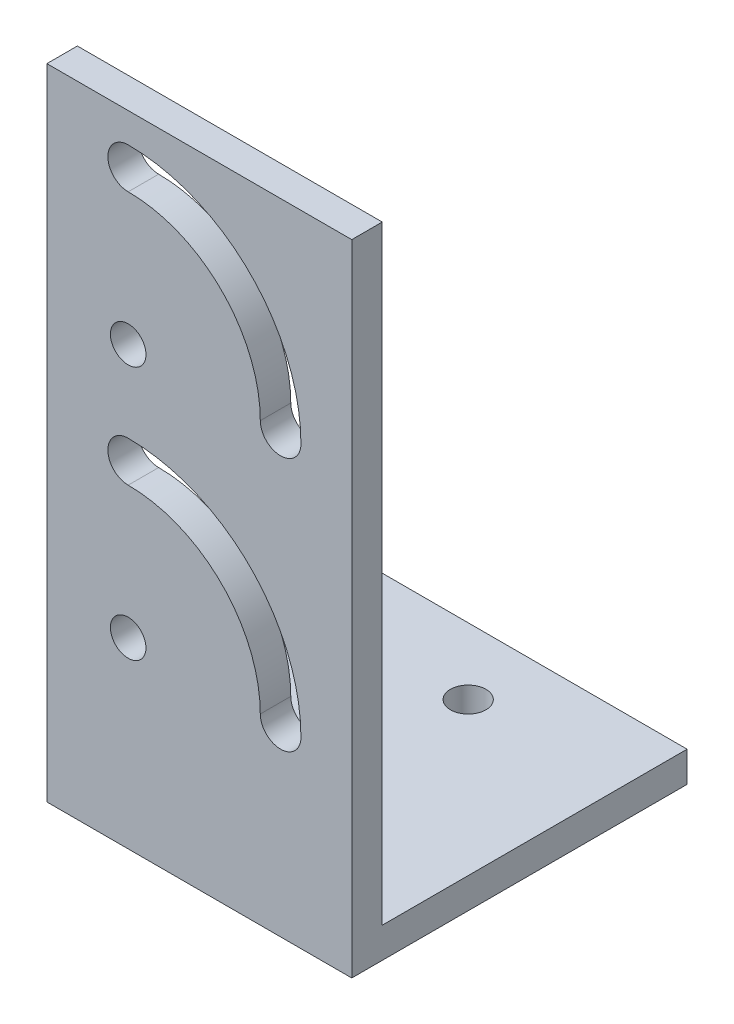
ISO-10303-21;
HEADER;
FILE_DESCRIPTION(('STEP AP214'),'2;1');
FILE_NAME('part.step','',(''),(''),'','','');
FILE_SCHEMA(('AUTOMOTIVE_DESIGN { 1 0 10303 214 1 1 1 1 }'));
ENDSEC;
DATA;
#1=APPLICATION_CONTEXT('core data for automotive mechanical design processes');
#2=APPLICATION_PROTOCOL_DEFINITION('international standard','automotive_design',2000,#1);
#3=PRODUCT_CONTEXT('',#1,'mechanical');
#4=PRODUCT('Part','Part','',(#3));
#5=PRODUCT_RELATED_PRODUCT_CATEGORY('part','',(#4));
#6=PRODUCT_DEFINITION_FORMATION('','',#4);
#7=PRODUCT_DEFINITION_CONTEXT('part definition',#1,'design');
#8=PRODUCT_DEFINITION('design','',#6,#7);
#9=PRODUCT_DEFINITION_SHAPE('','',#8);
#10=(LENGTH_UNIT() NAMED_UNIT(*) SI_UNIT(.MILLI.,.METRE.));
#11=(NAMED_UNIT(*) PLANE_ANGLE_UNIT() SI_UNIT($,.RADIAN.));
#12=(NAMED_UNIT(*) SI_UNIT($,.STERADIAN.) SOLID_ANGLE_UNIT());
#13=UNCERTAINTY_MEASURE_WITH_UNIT(LENGTH_MEASURE(1.E-05),#10,'distance_accuracy_value','');
#14=(GEOMETRIC_REPRESENTATION_CONTEXT(3) GLOBAL_UNCERTAINTY_ASSIGNED_CONTEXT((#13)) GLOBAL_UNIT_ASSIGNED_CONTEXT((#10,
#11,#12)) REPRESENTATION_CONTEXT('',''));
#15=CARTESIAN_POINT('',(0.,0.,0.));
#16=DIRECTION('',(0.,0.,1.));
#17=DIRECTION('',(1.,0.,0.));
#18=AXIS2_PLACEMENT_3D('',#15,#16,#17);
#19=CARTESIAN_POINT('',(0.,0.,15.));
#20=DIRECTION('',(0.,0.,-1.));
#21=DIRECTION('',(-1.,0.,0.));
#22=AXIS2_PLACEMENT_3D('',#19,#20,#21);
#23=PLANE('',#22);
#24=CARTESIAN_POINT('',(-7.,43.,15.));
#25=DIRECTION('',(0.,0.,1.));
#26=DIRECTION('',(1.,0.,0.));
#27=AXIS2_PLACEMENT_3D('',#24,#25,#26);
#28=CIRCLE('',#27,1.75);
#29=CARTESIAN_POINT('',(-5.25,43.,15.));
#30=VERTEX_POINT('',#29);
#31=EDGE_CURVE('E170',#30,#30,#28,.T.);
#32=ORIENTED_EDGE('',*,*,#31,.T.);
#33=EDGE_LOOP('',(#32));
#34=FACE_BOUND('',#33,.T.);
#35=CARTESIAN_POINT('',(-7.,33.,15.));
#36=DIRECTION('',(0.,0.,1.));
#37=DIRECTION('',(1.,0.,0.));
#38=AXIS2_PLACEMENT_3D('',#35,#36,#37);
#39=CIRCLE('',#38,2.);
#40=CARTESIAN_POINT('',(-7.,35.,15.));
#41=VERTEX_POINT('',#40);
#42=CARTESIAN_POINT('',(-7.,31.,15.));
#43=VERTEX_POINT('',#42);
#44=EDGE_CURVE('E179',#41,#43,#39,.T.);
#45=ORIENTED_EDGE('',*,*,#44,.T.);
#46=CARTESIAN_POINT('',(-7.,18.,15.));
#47=DIRECTION('',(0.,0.,-1.));
#48=DIRECTION('',(1.,0.,0.));
#49=AXIS2_PLACEMENT_3D('',#46,#47,#48);
#50=CIRCLE('',#49,13.);
#51=CARTESIAN_POINT('',(6.,18.,15.));
#52=VERTEX_POINT('',#51);
#53=EDGE_CURVE('E182',#43,#52,#50,.T.);
#54=ORIENTED_EDGE('',*,*,#53,.T.);
#55=CARTESIAN_POINT('',(8.,18.,15.));
#56=DIRECTION('',(0.,0.,1.));
#57=DIRECTION('',(1.,0.,0.));
#58=AXIS2_PLACEMENT_3D('',#55,#56,#57);
#59=CIRCLE('',#58,2.);
#60=CARTESIAN_POINT('',(10.,18.,15.));
#61=VERTEX_POINT('',#60);
#62=EDGE_CURVE('E58',#52,#61,#59,.T.);
#63=ORIENTED_EDGE('',*,*,#62,.T.);
#64=CARTESIAN_POINT('',(-7.,18.,15.));
#65=DIRECTION('',(0.,0.,1.));
#66=DIRECTION('',(1.,0.,0.));
#67=AXIS2_PLACEMENT_3D('',#64,#65,#66);
#68=CIRCLE('',#67,17.);
#69=EDGE_CURVE('E187',#61,#41,#68,.T.);
#70=ORIENTED_EDGE('',*,*,#69,.T.);
#71=EDGE_LOOP('',(#45,#54,#63,#70));
#72=FACE_BOUND('',#71,.T.);
#73=DIRECTION('',(1.,0.,0.));
#74=VECTOR('',#73,1.);
#75=CARTESIAN_POINT('',(-15.,3.,15.));
#76=LINE('',#75,#74);
#77=CARTESIAN_POINT('',(-15.,3.,15.));
#78=VERTEX_POINT('',#77);
#79=CARTESIAN_POINT('',(15.,3.,15.));
#80=VERTEX_POINT('',#79);
#81=EDGE_CURVE('E255',#78,#80,#76,.T.);
#82=ORIENTED_EDGE('',*,*,#81,.F.);
#83=DIRECTION('',(0.,-1.,0.));
#84=VECTOR('',#83,1.);
#85=CARTESIAN_POINT('',(-15.,0.,15.));
#86=LINE('',#85,#84);
#87=CARTESIAN_POINT('',(-15.,62.9241904633983,15.));
#88=VERTEX_POINT('',#87);
#89=EDGE_CURVE('E204',#88,#78,#86,.T.);
#90=ORIENTED_EDGE('',*,*,#89,.F.);
#91=DIRECTION('',(-1.,0.,0.));
#92=VECTOR('',#91,1.);
#93=CARTESIAN_POINT('',(-15.,62.9241904633983,15.));
#94=LINE('',#93,#92);
#95=CARTESIAN_POINT('',(15.,62.9241904633983,15.));
#96=VERTEX_POINT('',#95);
#97=EDGE_CURVE('E215',#96,#88,#94,.T.);
#98=ORIENTED_EDGE('',*,*,#97,.F.);
#99=DIRECTION('',(0.,1.,0.));
#100=VECTOR('',#99,1.);
#101=CARTESIAN_POINT('',(15.,0.,15.));
#102=LINE('',#101,#100);
#103=EDGE_CURVE('E225',#80,#96,#102,.T.);
#104=ORIENTED_EDGE('',*,*,#103,.F.);
#105=EDGE_LOOP('',(#82,#90,#98,#104));
#106=FACE_BOUND('',#105,.T.);
#107=CARTESIAN_POINT('',(-7.,58.,15.));
#108=DIRECTION('',(0.,0.,1.));
#109=DIRECTION('',(1.,0.,0.));
#110=AXIS2_PLACEMENT_3D('',#107,#108,#109);
#111=CIRCLE('',#110,2.);
#112=CARTESIAN_POINT('',(-7.,60.,15.));
#113=VERTEX_POINT('',#112);
#114=CARTESIAN_POINT('',(-7.,56.,15.));
#115=VERTEX_POINT('',#114);
#116=EDGE_CURVE('E140',#113,#115,#111,.T.);
#117=ORIENTED_EDGE('',*,*,#116,.T.);
#118=CARTESIAN_POINT('',(-7.,43.,15.));
#119=DIRECTION('',(0.,0.,-1.));
#120=DIRECTION('',(1.,0.,0.));
#121=AXIS2_PLACEMENT_3D('',#118,#119,#120);
#122=CIRCLE('',#121,13.);
#123=CARTESIAN_POINT('',(6.,43.,15.));
#124=VERTEX_POINT('',#123);
#125=EDGE_CURVE('E151',#115,#124,#122,.T.);
#126=ORIENTED_EDGE('',*,*,#125,.T.);
#127=CARTESIAN_POINT('',(8.,43.,15.));
#128=DIRECTION('',(0.,0.,1.));
#129=DIRECTION('',(1.,0.,0.));
#130=AXIS2_PLACEMENT_3D('',#127,#128,#129);
#131=CIRCLE('',#130,2.);
#132=CARTESIAN_POINT('',(10.,43.,15.));
#133=VERTEX_POINT('',#132);
#134=EDGE_CURVE('E50',#124,#133,#131,.T.);
#135=ORIENTED_EDGE('',*,*,#134,.T.);
#136=CARTESIAN_POINT('',(-7.,43.,15.));
#137=DIRECTION('',(0.,0.,1.));
#138=DIRECTION('',(1.,0.,0.));
#139=AXIS2_PLACEMENT_3D('',#136,#137,#138);
#140=CIRCLE('',#139,17.);
#141=EDGE_CURVE('E148',#133,#113,#140,.T.);
#142=ORIENTED_EDGE('',*,*,#141,.T.);
#143=EDGE_LOOP('',(#117,#126,#135,#142));
#144=FACE_BOUND('',#143,.T.);
#145=CARTESIAN_POINT('',(-7.,18.,15.));
#146=DIRECTION('',(0.,0.,1.));
#147=DIRECTION('',(1.,0.,0.));
#148=AXIS2_PLACEMENT_3D('',#145,#146,#147);
#149=CIRCLE('',#148,1.75);
#150=CARTESIAN_POINT('',(-5.25,18.,15.));
#151=VERTEX_POINT('',#150);
#152=EDGE_CURVE('E194',#151,#151,#149,.T.);
#153=ORIENTED_EDGE('',*,*,#152,.T.);
#154=EDGE_LOOP('',(#153));
#155=FACE_BOUND('',#154,.T.);
#156=ADVANCED_FACE('F35',(#34,#72,#106,#144,#155),#23,.T.);
#157=CARTESIAN_POINT('',(0.,0.,18.));
#158=DIRECTION('',(0.,0.,-1.));
#159=DIRECTION('',(-1.,0.,0.));
#160=AXIS2_PLACEMENT_3D('',#157,#158,#159);
#161=PLANE('',#160);
#162=CARTESIAN_POINT('',(-7.,43.,18.));
#163=DIRECTION('',(0.,0.,-1.));
#164=DIRECTION('',(1.,0.,0.));
#165=AXIS2_PLACEMENT_3D('',#162,#163,#164);
#166=CIRCLE('',#165,13.);
#167=CARTESIAN_POINT('',(-7.,56.,18.));
#168=VERTEX_POINT('',#167);
#169=CARTESIAN_POINT('',(6.,43.,18.));
#170=VERTEX_POINT('',#169);
#171=EDGE_CURVE('E169',#168,#170,#166,.T.);
#172=ORIENTED_EDGE('',*,*,#171,.F.);
#173=CARTESIAN_POINT('',(-7.,58.,18.));
#174=DIRECTION('',(0.,0.,1.));
#175=DIRECTION('',(1.,0.,0.));
#176=AXIS2_PLACEMENT_3D('',#173,#174,#175);
#177=CIRCLE('',#176,2.);
#178=CARTESIAN_POINT('',(-7.,60.,18.));
#179=VERTEX_POINT('',#178);
#180=EDGE_CURVE('E143',#179,#168,#177,.T.);
#181=ORIENTED_EDGE('',*,*,#180,.F.);
#182=CARTESIAN_POINT('',(-7.,43.,18.));
#183=DIRECTION('',(0.,0.,1.));
#184=DIRECTION('',(1.,0.,0.));
#185=AXIS2_PLACEMENT_3D('',#182,#183,#184);
#186=CIRCLE('',#185,17.);
#187=CARTESIAN_POINT('',(10.,43.,18.));
#188=VERTEX_POINT('',#187);
#189=EDGE_CURVE('E157',#188,#179,#186,.T.);
#190=ORIENTED_EDGE('',*,*,#189,.F.);
#191=CARTESIAN_POINT('',(8.,43.,18.));
#192=DIRECTION('',(0.,0.,1.));
#193=DIRECTION('',(1.,0.,0.));
#194=AXIS2_PLACEMENT_3D('',#191,#192,#193);
#195=CIRCLE('',#194,2.);
#196=EDGE_CURVE('E160',#170,#188,#195,.T.);
#197=ORIENTED_EDGE('',*,*,#196,.F.);
#198=EDGE_LOOP('',(#172,#181,#190,#197));
#199=FACE_BOUND('',#198,.T.);
#200=CARTESIAN_POINT('',(-7.,43.,18.));
#201=DIRECTION('',(0.,0.,1.));
#202=DIRECTION('',(1.,0.,0.));
#203=AXIS2_PLACEMENT_3D('',#200,#201,#202);
#204=CIRCLE('',#203,1.75);
#205=CARTESIAN_POINT('',(-5.25,43.,18.));
#206=VERTEX_POINT('',#205);
#207=EDGE_CURVE('E497',#206,#206,#204,.T.);
#208=ORIENTED_EDGE('',*,*,#207,.F.);
#209=EDGE_LOOP('',(#208));
#210=FACE_BOUND('',#209,.T.);
#211=DIRECTION('',(0.,-1.,0.));
#212=VECTOR('',#211,1.);
#213=CARTESIAN_POINT('',(-15.,0.,18.));
#214=LINE('',#213,#212);
#215=CARTESIAN_POINT('',(-15.,62.9241904633983,18.));
#216=VERTEX_POINT('',#215);
#217=CARTESIAN_POINT('',(-15.,0.,18.));
#218=VERTEX_POINT('',#217);
#219=EDGE_CURVE('E211',#216,#218,#214,.T.);
#220=ORIENTED_EDGE('',*,*,#219,.T.);
#221=DIRECTION('',(1.,0.,0.));
#222=VECTOR('',#221,1.);
#223=CARTESIAN_POINT('',(-15.,0.,18.));
#224=LINE('',#223,#222);
#225=CARTESIAN_POINT('',(15.,0.,18.));
#226=VERTEX_POINT('',#225);
#227=EDGE_CURVE('E214',#218,#226,#224,.T.);
#228=ORIENTED_EDGE('',*,*,#227,.T.);
#229=DIRECTION('',(0.,1.,0.));
#230=VECTOR('',#229,1.);
#231=CARTESIAN_POINT('',(15.,0.,18.));
#232=LINE('',#231,#230);
#233=CARTESIAN_POINT('',(15.,62.9241904633983,18.));
#234=VERTEX_POINT('',#233);
#235=EDGE_CURVE('E218',#226,#234,#232,.T.);
#236=ORIENTED_EDGE('',*,*,#235,.T.);
#237=DIRECTION('',(-1.,0.,0.));
#238=VECTOR('',#237,1.);
#239=CARTESIAN_POINT('',(-15.,62.9241904633983,18.));
#240=LINE('',#239,#238);
#241=EDGE_CURVE('E220',#234,#216,#240,.T.);
#242=ORIENTED_EDGE('',*,*,#241,.T.);
#243=EDGE_LOOP('',(#220,#228,#236,#242));
#244=FACE_BOUND('',#243,.T.);
#245=CARTESIAN_POINT('',(-7.,18.,18.));
#246=DIRECTION('',(0.,0.,-1.));
#247=DIRECTION('',(1.,0.,0.));
#248=AXIS2_PLACEMENT_3D('',#245,#246,#247);
#249=CIRCLE('',#248,13.);
#250=CARTESIAN_POINT('',(-7.,31.,18.));
#251=VERTEX_POINT('',#250);
#252=CARTESIAN_POINT('',(6.,18.,18.));
#253=VERTEX_POINT('',#252);
#254=EDGE_CURVE('E193',#251,#253,#249,.T.);
#255=ORIENTED_EDGE('',*,*,#254,.F.);
#256=CARTESIAN_POINT('',(-7.,33.,18.));
#257=DIRECTION('',(0.,0.,1.));
#258=DIRECTION('',(1.,0.,0.));
#259=AXIS2_PLACEMENT_3D('',#256,#257,#258);
#260=CIRCLE('',#259,2.);
#261=CARTESIAN_POINT('',(-7.,35.,18.));
#262=VERTEX_POINT('',#261);
#263=EDGE_CURVE('E191',#262,#251,#260,.T.);
#264=ORIENTED_EDGE('',*,*,#263,.F.);
#265=CARTESIAN_POINT('',(-7.,18.,18.));
#266=DIRECTION('',(0.,0.,1.));
#267=DIRECTION('',(1.,0.,0.));
#268=AXIS2_PLACEMENT_3D('',#265,#266,#267);
#269=CIRCLE('',#268,17.);
#270=CARTESIAN_POINT('',(10.,18.,18.));
#271=VERTEX_POINT('',#270);
#272=EDGE_CURVE('E183',#271,#262,#269,.T.);
#273=ORIENTED_EDGE('',*,*,#272,.F.);
#274=CARTESIAN_POINT('',(8.,18.,18.));
#275=DIRECTION('',(0.,0.,1.));
#276=DIRECTION('',(1.,0.,0.));
#277=AXIS2_PLACEMENT_3D('',#274,#275,#276);
#278=CIRCLE('',#277,2.);
#279=EDGE_CURVE('E197',#253,#271,#278,.T.);
#280=ORIENTED_EDGE('',*,*,#279,.F.);
#281=EDGE_LOOP('',(#255,#264,#273,#280));
#282=FACE_BOUND('',#281,.T.);
#283=CARTESIAN_POINT('',(-7.,18.,18.));
#284=DIRECTION('',(0.,0.,1.));
#285=DIRECTION('',(1.,0.,0.));
#286=AXIS2_PLACEMENT_3D('',#283,#284,#285);
#287=CIRCLE('',#286,1.75);
#288=CARTESIAN_POINT('',(-5.25,18.,18.));
#289=VERTEX_POINT('',#288);
#290=EDGE_CURVE('E163',#289,#289,#287,.T.);
#291=ORIENTED_EDGE('',*,*,#290,.F.);
#292=EDGE_LOOP('',(#291));
#293=FACE_BOUND('',#292,.T.);
#294=ADVANCED_FACE('F275',(#199,#210,#244,#282,#293),#161,.F.);
#295=CARTESIAN_POINT('',(15.,3.,15.));
#296=DIRECTION('',(-1.,0.,0.));
#297=DIRECTION('',(0.,0.,1.));
#298=AXIS2_PLACEMENT_3D('',#295,#296,#297);
#299=PLANE('',#298);
#300=DIRECTION('',(0.,0.,-1.));
#301=VECTOR('',#300,1.);
#302=CARTESIAN_POINT('',(15.,0.,15.));
#303=LINE('',#302,#301);
#304=CARTESIAN_POINT('',(15.,0.,-15.));
#305=VERTEX_POINT('',#304);
#306=EDGE_CURVE('E237',#226,#305,#303,.T.);
#307=ORIENTED_EDGE('',*,*,#306,.T.);
#308=DIRECTION('',(0.,-1.,0.));
#309=VECTOR('',#308,1.);
#310=CARTESIAN_POINT('',(15.,3.,-15.));
#311=LINE('',#310,#309);
#312=CARTESIAN_POINT('',(15.,3.,-15.));
#313=VERTEX_POINT('',#312);
#314=EDGE_CURVE('E11',#313,#305,#311,.T.);
#315=ORIENTED_EDGE('',*,*,#314,.F.);
#316=DIRECTION('',(0.,0.,-1.));
#317=VECTOR('',#316,1.);
#318=CARTESIAN_POINT('',(15.,3.,15.));
#319=LINE('',#318,#317);
#320=EDGE_CURVE('E246',#80,#313,#319,.T.);
#321=ORIENTED_EDGE('',*,*,#320,.F.);
#322=ORIENTED_EDGE('',*,*,#103,.T.);
#323=DIRECTION('',(0.,0.,-1.));
#324=VECTOR('',#323,1.);
#325=CARTESIAN_POINT('',(15.,62.9241904633983,18.));
#326=LINE('',#325,#324);
#327=EDGE_CURVE('E230',#234,#96,#326,.T.);
#328=ORIENTED_EDGE('',*,*,#327,.F.);
#329=ORIENTED_EDGE('',*,*,#235,.F.);
#330=EDGE_LOOP('',(#307,#315,#321,#322,#328,#329));
#331=FACE_BOUND('',#330,.T.);
#332=ADVANCED_FACE('F37',(#331),#299,.F.);
#333=CARTESIAN_POINT('',(-15.,3.,-15.));
#334=DIRECTION('',(0.,0.,1.));
#335=DIRECTION('',(1.,0.,0.));
#336=AXIS2_PLACEMENT_3D('',#333,#334,#335);
#337=PLANE('',#336);
#338=DIRECTION('',(-1.,0.,0.));
#339=VECTOR('',#338,1.);
#340=CARTESIAN_POINT('',(-15.,0.,-15.));
#341=LINE('',#340,#339);
#342=CARTESIAN_POINT('',(-15.,0.,-15.));
#343=VERTEX_POINT('',#342);
#344=EDGE_CURVE('E260',#305,#343,#341,.T.);
#345=ORIENTED_EDGE('',*,*,#344,.T.);
#346=DIRECTION('',(0.,-1.,0.));
#347=VECTOR('',#346,1.);
#348=CARTESIAN_POINT('',(-15.,3.,-15.));
#349=LINE('',#348,#347);
#350=CARTESIAN_POINT('',(-15.,3.,-15.));
#351=VERTEX_POINT('',#350);
#352=EDGE_CURVE('E43',#351,#343,#349,.T.);
#353=ORIENTED_EDGE('',*,*,#352,.F.);
#354=DIRECTION('',(-1.,0.,0.));
#355=VECTOR('',#354,1.);
#356=CARTESIAN_POINT('',(-15.,3.,-15.));
#357=LINE('',#356,#355);
#358=EDGE_CURVE('E249',#313,#351,#357,.T.);
#359=ORIENTED_EDGE('',*,*,#358,.F.);
#360=ORIENTED_EDGE('',*,*,#314,.T.);
#361=EDGE_LOOP('',(#345,#353,#359,#360));
#362=FACE_BOUND('',#361,.T.);
#363=ADVANCED_FACE('F289',(#362),#337,.F.);
#364=CARTESIAN_POINT('',(-15.,3.,15.));
#365=DIRECTION('',(1.,0.,0.));
#366=DIRECTION('',(0.,0.,-1.));
#367=AXIS2_PLACEMENT_3D('',#364,#365,#366);
#368=PLANE('',#367);
#369=DIRECTION('',(0.,0.,1.));
#370=VECTOR('',#369,1.);
#371=CARTESIAN_POINT('',(-15.,0.,15.));
#372=LINE('',#371,#370);
#373=EDGE_CURVE('E250',#343,#218,#372,.T.);
#374=ORIENTED_EDGE('',*,*,#373,.T.);
#375=ORIENTED_EDGE('',*,*,#219,.F.);
#376=DIRECTION('',(0.,0.,-1.));
#377=VECTOR('',#376,1.);
#378=CARTESIAN_POINT('',(-15.,62.9241904633983,18.));
#379=LINE('',#378,#377);
#380=EDGE_CURVE('E222',#216,#88,#379,.T.);
#381=ORIENTED_EDGE('',*,*,#380,.T.);
#382=ORIENTED_EDGE('',*,*,#89,.T.);
#383=DIRECTION('',(0.,0.,1.));
#384=VECTOR('',#383,1.);
#385=CARTESIAN_POINT('',(-15.,3.,15.));
#386=LINE('',#385,#384);
#387=EDGE_CURVE('E252',#351,#78,#386,.T.);
#388=ORIENTED_EDGE('',*,*,#387,.F.);
#389=ORIENTED_EDGE('',*,*,#352,.T.);
#390=EDGE_LOOP('',(#374,#375,#381,#382,#388,#389));
#391=FACE_BOUND('',#390,.T.);
#392=ADVANCED_FACE('F267',(#391),#368,.F.);
#393=CARTESIAN_POINT('',(0.,3.,0.));
#394=DIRECTION('',(0.,-1.,0.));
#395=DIRECTION('',(0.,0.,-1.));
#396=AXIS2_PLACEMENT_3D('',#393,#394,#395);
#397=PLANE('',#396);
#398=CARTESIAN_POINT('',(0.,3.,6.54268355275151));
#399=DIRECTION('',(0.,1.,0.));
#400=DIRECTION('',(0.,0.,1.));
#401=AXIS2_PLACEMENT_3D('',#398,#399,#400);
#402=CIRCLE('',#401,1.75);
#403=CARTESIAN_POINT('',(0.,3.,8.29268355275151));
#404=VERTEX_POINT('',#403);
#405=EDGE_CURVE('E238',#404,#404,#402,.T.);
#406=ORIENTED_EDGE('',*,*,#405,.F.);
#407=EDGE_LOOP('',(#406));
#408=FACE_BOUND('',#407,.T.);
#409=CARTESIAN_POINT('',(0.,3.,-8.45731644724849));
#410=DIRECTION('',(0.,1.,0.));
#411=DIRECTION('',(0.,0.,1.));
#412=AXIS2_PLACEMENT_3D('',#409,#410,#411);
#413=CIRCLE('',#412,1.75);
#414=CARTESIAN_POINT('',(0.,3.,-6.70731644724849));
#415=VERTEX_POINT('',#414);
#416=EDGE_CURVE('E233',#415,#415,#413,.T.);
#417=ORIENTED_EDGE('',*,*,#416,.F.);
#418=EDGE_LOOP('',(#417));
#419=FACE_BOUND('',#418,.T.);
#420=ORIENTED_EDGE('',*,*,#320,.T.);
#421=ORIENTED_EDGE('',*,*,#358,.T.);
#422=ORIENTED_EDGE('',*,*,#387,.T.);
#423=ORIENTED_EDGE('',*,*,#81,.T.);
#424=EDGE_LOOP('',(#420,#421,#422,#423));
#425=FACE_BOUND('',#424,.T.);
#426=ADVANCED_FACE('F285',(#408,#419,#425),#397,.F.);
#427=CARTESIAN_POINT('',(0.,0.,0.));
#428=DIRECTION('',(0.,-1.,0.));
#429=DIRECTION('',(0.,0.,-1.));
#430=AXIS2_PLACEMENT_3D('',#427,#428,#429);
#431=PLANE('',#430);
#432=CARTESIAN_POINT('',(0.,0.,6.54268355275151));
#433=DIRECTION('',(0.,1.,0.));
#434=DIRECTION('',(0.,0.,1.));
#435=AXIS2_PLACEMENT_3D('',#432,#433,#434);
#436=CIRCLE('',#435,1.75);
#437=CARTESIAN_POINT('',(0.,0.,8.29268355275151));
#438=VERTEX_POINT('',#437);
#439=EDGE_CURVE('E234',#438,#438,#436,.T.);
#440=ORIENTED_EDGE('',*,*,#439,.T.);
#441=EDGE_LOOP('',(#440));
#442=FACE_BOUND('',#441,.T.);
#443=CARTESIAN_POINT('',(0.,0.,-8.45731644724849));
#444=DIRECTION('',(0.,1.,0.));
#445=DIRECTION('',(0.,0.,1.));
#446=AXIS2_PLACEMENT_3D('',#443,#444,#445);
#447=CIRCLE('',#446,1.75);
#448=CARTESIAN_POINT('',(0.,0.,-6.70731644724849));
#449=VERTEX_POINT('',#448);
#450=EDGE_CURVE('E241',#449,#449,#447,.T.);
#451=ORIENTED_EDGE('',*,*,#450,.T.);
#452=EDGE_LOOP('',(#451));
#453=FACE_BOUND('',#452,.T.);
#454=ORIENTED_EDGE('',*,*,#306,.F.);
#455=ORIENTED_EDGE('',*,*,#227,.F.);
#456=ORIENTED_EDGE('',*,*,#373,.F.);
#457=ORIENTED_EDGE('',*,*,#344,.F.);
#458=EDGE_LOOP('',(#454,#455,#456,#457));
#459=FACE_BOUND('',#458,.T.);
#460=ADVANCED_FACE('F272',(#442,#453,#459),#431,.T.);
#461=CARTESIAN_POINT('',(0.,0.,-8.45731644724849));
#462=DIRECTION('',(0.,1.,0.));
#463=DIRECTION('',(0.,0.,1.));
#464=AXIS2_PLACEMENT_3D('',#461,#462,#463);
#465=CYLINDRICAL_SURFACE('',#464,1.75);
#466=ORIENTED_EDGE('',*,*,#450,.F.);
#467=EDGE_LOOP('',(#466));
#468=FACE_BOUND('',#467,.T.);
#469=ORIENTED_EDGE('',*,*,#416,.T.);
#470=EDGE_LOOP('',(#469));
#471=FACE_BOUND('',#470,.T.);
#472=ADVANCED_FACE('F315',(#468,#471),#465,.F.);
#473=CARTESIAN_POINT('',(0.,0.,6.54268355275151));
#474=DIRECTION('',(0.,1.,0.));
#475=DIRECTION('',(0.,0.,1.));
#476=AXIS2_PLACEMENT_3D('',#473,#474,#475);
#477=CYLINDRICAL_SURFACE('',#476,1.75);
#478=ORIENTED_EDGE('',*,*,#439,.F.);
#479=EDGE_LOOP('',(#478));
#480=FACE_BOUND('',#479,.T.);
#481=ORIENTED_EDGE('',*,*,#405,.T.);
#482=EDGE_LOOP('',(#481));
#483=FACE_BOUND('',#482,.T.);
#484=ADVANCED_FACE('F312',(#480,#483),#477,.F.);
#485=CARTESIAN_POINT('',(-15.,62.9241904633983,18.));
#486=DIRECTION('',(0.,-1.,0.));
#487=DIRECTION('',(0.,0.,-1.));
#488=AXIS2_PLACEMENT_3D('',#485,#486,#487);
#489=PLANE('',#488);
#490=ORIENTED_EDGE('',*,*,#97,.T.);
#491=ORIENTED_EDGE('',*,*,#380,.F.);
#492=ORIENTED_EDGE('',*,*,#241,.F.);
#493=ORIENTED_EDGE('',*,*,#327,.T.);
#494=EDGE_LOOP('',(#490,#491,#492,#493));
#495=FACE_BOUND('',#494,.T.);
#496=ADVANCED_FACE('F308',(#495),#489,.F.);
#497=CARTESIAN_POINT('',(-7.,33.,15.));
#498=DIRECTION('',(0.,0.,1.));
#499=DIRECTION('',(1.,0.,0.));
#500=AXIS2_PLACEMENT_3D('',#497,#498,#499);
#501=CYLINDRICAL_SURFACE('',#500,2.);
#502=ORIENTED_EDGE('',*,*,#263,.T.);
#503=DIRECTION('',(0.,0.,1.));
#504=VECTOR('',#503,1.);
#505=CARTESIAN_POINT('',(-7.,31.,15.));
#506=LINE('',#505,#504);
#507=EDGE_CURVE('E190',#43,#251,#506,.T.);
#508=ORIENTED_EDGE('',*,*,#507,.F.);
#509=ORIENTED_EDGE('',*,*,#44,.F.);
#510=DIRECTION('',(0.,0.,1.));
#511=VECTOR('',#510,1.);
#512=CARTESIAN_POINT('',(-7.,35.,15.));
#513=LINE('',#512,#511);
#514=EDGE_CURVE('E202',#41,#262,#513,.T.);
#515=ORIENTED_EDGE('',*,*,#514,.T.);
#516=EDGE_LOOP('',(#502,#508,#509,#515));
#517=FACE_BOUND('',#516,.T.);
#518=ADVANCED_FACE('F311',(#517),#501,.F.);
#519=CARTESIAN_POINT('',(-7.,18.,15.));
#520=DIRECTION('',(0.,0.,1.));
#521=DIRECTION('',(1.,0.,0.));
#522=AXIS2_PLACEMENT_3D('',#519,#520,#521);
#523=CYLINDRICAL_SURFACE('',#522,17.);
#524=ORIENTED_EDGE('',*,*,#272,.T.);
#525=ORIENTED_EDGE('',*,*,#514,.F.);
#526=ORIENTED_EDGE('',*,*,#69,.F.);
#527=DIRECTION('',(0.,0.,1.));
#528=VECTOR('',#527,1.);
#529=CARTESIAN_POINT('',(10.,18.,15.));
#530=LINE('',#529,#528);
#531=EDGE_CURVE('E205',#61,#271,#530,.T.);
#532=ORIENTED_EDGE('',*,*,#531,.T.);
#533=EDGE_LOOP('',(#524,#525,#526,#532));
#534=FACE_BOUND('',#533,.T.);
#535=ADVANCED_FACE('F356',(#534),#523,.F.);
#536=CARTESIAN_POINT('',(8.,18.,15.));
#537=DIRECTION('',(0.,0.,1.));
#538=DIRECTION('',(1.,0.,0.));
#539=AXIS2_PLACEMENT_3D('',#536,#537,#538);
#540=CYLINDRICAL_SURFACE('',#539,2.);
#541=ORIENTED_EDGE('',*,*,#279,.T.);
#542=ORIENTED_EDGE('',*,*,#531,.F.);
#543=ORIENTED_EDGE('',*,*,#62,.F.);
#544=DIRECTION('',(0.,0.,1.));
#545=VECTOR('',#544,1.);
#546=CARTESIAN_POINT('',(6.,18.,15.));
#547=LINE('',#546,#545);
#548=EDGE_CURVE('E207',#52,#253,#547,.T.);
#549=ORIENTED_EDGE('',*,*,#548,.T.);
#550=EDGE_LOOP('',(#541,#542,#543,#549));
#551=FACE_BOUND('',#550,.T.);
#552=ADVANCED_FACE('F364',(#551),#540,.F.);
#553=CARTESIAN_POINT('',(-7.,18.,15.));
#554=DIRECTION('',(0.,0.,1.));
#555=DIRECTION('',(1.,0.,0.));
#556=AXIS2_PLACEMENT_3D('',#553,#554,#555);
#557=CYLINDRICAL_SURFACE('',#556,13.);
#558=ORIENTED_EDGE('',*,*,#254,.T.);
#559=ORIENTED_EDGE('',*,*,#548,.F.);
#560=ORIENTED_EDGE('',*,*,#53,.F.);
#561=ORIENTED_EDGE('',*,*,#507,.T.);
#562=EDGE_LOOP('',(#558,#559,#560,#561));
#563=FACE_BOUND('',#562,.T.);
#564=ADVANCED_FACE('F372',(#563),#557,.T.);
#565=CARTESIAN_POINT('',(-7.,43.,15.));
#566=DIRECTION('',(0.,0.,1.));
#567=DIRECTION('',(1.,0.,0.));
#568=AXIS2_PLACEMENT_3D('',#565,#566,#567);
#569=CYLINDRICAL_SURFACE('',#568,1.75);
#570=ORIENTED_EDGE('',*,*,#31,.F.);
#571=EDGE_LOOP('',(#570));
#572=FACE_BOUND('',#571,.T.);
#573=ORIENTED_EDGE('',*,*,#207,.T.);
#574=EDGE_LOOP('',(#573));
#575=FACE_BOUND('',#574,.T.);
#576=ADVANCED_FACE('F379',(#572,#575),#569,.F.);
#577=CARTESIAN_POINT('',(-7.,58.,15.));
#578=DIRECTION('',(0.,0.,1.));
#579=DIRECTION('',(1.,0.,0.));
#580=AXIS2_PLACEMENT_3D('',#577,#578,#579);
#581=CYLINDRICAL_SURFACE('',#580,2.);
#582=ORIENTED_EDGE('',*,*,#180,.T.);
#583=DIRECTION('',(0.,0.,1.));
#584=VECTOR('',#583,1.);
#585=CARTESIAN_POINT('',(-7.,56.,15.));
#586=LINE('',#585,#584);
#587=EDGE_CURVE('E136',#115,#168,#586,.T.);
#588=ORIENTED_EDGE('',*,*,#587,.F.);
#589=ORIENTED_EDGE('',*,*,#116,.F.);
#590=DIRECTION('',(0.,0.,1.));
#591=VECTOR('',#590,1.);
#592=CARTESIAN_POINT('',(-7.,60.,15.));
#593=LINE('',#592,#591);
#594=EDGE_CURVE('E174',#113,#179,#593,.T.);
#595=ORIENTED_EDGE('',*,*,#594,.T.);
#596=EDGE_LOOP('',(#582,#588,#589,#595));
#597=FACE_BOUND('',#596,.T.);
#598=ADVANCED_FACE('F138',(#597),#581,.F.);
#599=CARTESIAN_POINT('',(-7.,43.,15.));
#600=DIRECTION('',(0.,0.,1.));
#601=DIRECTION('',(1.,0.,0.));
#602=AXIS2_PLACEMENT_3D('',#599,#600,#601);
#603=CYLINDRICAL_SURFACE('',#602,17.);
#604=ORIENTED_EDGE('',*,*,#189,.T.);
#605=ORIENTED_EDGE('',*,*,#594,.F.);
#606=ORIENTED_EDGE('',*,*,#141,.F.);
#607=DIRECTION('',(0.,0.,1.));
#608=VECTOR('',#607,1.);
#609=CARTESIAN_POINT('',(10.,43.,15.));
#610=LINE('',#609,#608);
#611=EDGE_CURVE('E176',#133,#188,#610,.T.);
#612=ORIENTED_EDGE('',*,*,#611,.T.);
#613=EDGE_LOOP('',(#604,#605,#606,#612));
#614=FACE_BOUND('',#613,.T.);
#615=ADVANCED_FACE('F394',(#614),#603,.F.);
#616=CARTESIAN_POINT('',(8.,43.,15.));
#617=DIRECTION('',(0.,0.,1.));
#618=DIRECTION('',(1.,0.,0.));
#619=AXIS2_PLACEMENT_3D('',#616,#617,#618);
#620=CYLINDRICAL_SURFACE('',#619,2.);
#621=ORIENTED_EDGE('',*,*,#196,.T.);
#622=ORIENTED_EDGE('',*,*,#611,.F.);
#623=ORIENTED_EDGE('',*,*,#134,.F.);
#624=DIRECTION('',(0.,0.,1.));
#625=VECTOR('',#624,1.);
#626=CARTESIAN_POINT('',(6.,43.,15.));
#627=LINE('',#626,#625);
#628=EDGE_CURVE('E147',#124,#170,#627,.T.);
#629=ORIENTED_EDGE('',*,*,#628,.T.);
#630=EDGE_LOOP('',(#621,#622,#623,#629));
#631=FACE_BOUND('',#630,.T.);
#632=ADVANCED_FACE('F401',(#631),#620,.F.);
#633=CARTESIAN_POINT('',(-7.,43.,15.));
#634=DIRECTION('',(0.,0.,1.));
#635=DIRECTION('',(1.,0.,0.));
#636=AXIS2_PLACEMENT_3D('',#633,#634,#635);
#637=CYLINDRICAL_SURFACE('',#636,13.);
#638=ORIENTED_EDGE('',*,*,#171,.T.);
#639=ORIENTED_EDGE('',*,*,#628,.F.);
#640=ORIENTED_EDGE('',*,*,#125,.F.);
#641=ORIENTED_EDGE('',*,*,#587,.T.);
#642=EDGE_LOOP('',(#638,#639,#640,#641));
#643=FACE_BOUND('',#642,.T.);
#644=ADVANCED_FACE('F152',(#643),#637,.T.);
#645=CARTESIAN_POINT('',(-7.,18.,15.));
#646=DIRECTION('',(0.,0.,1.));
#647=DIRECTION('',(1.,0.,0.));
#648=AXIS2_PLACEMENT_3D('',#645,#646,#647);
#649=CYLINDRICAL_SURFACE('',#648,1.75);
#650=ORIENTED_EDGE('',*,*,#152,.F.);
#651=EDGE_LOOP('',(#650));
#652=FACE_BOUND('',#651,.T.);
#653=ORIENTED_EDGE('',*,*,#290,.T.);
#654=EDGE_LOOP('',(#653));
#655=FACE_BOUND('',#654,.T.);
#656=ADVANCED_FACE('F415',(#652,#655),#649,.F.);
#657=CLOSED_SHELL('',(#156,#294,#332,#363,#392,#426,#460,#472,#484,#496,#518,#535,#552,#564,
#576,#598,#615,#632,#644,#656));
#658=MANIFOLD_SOLID_BREP('B2',#657);
#659=ADVANCED_BREP_SHAPE_REPRESENTATION('',(#18,#658),#14);
#660=SHAPE_DEFINITION_REPRESENTATION(#9,#659);
ENDSEC;
END-ISO-10303-21;
